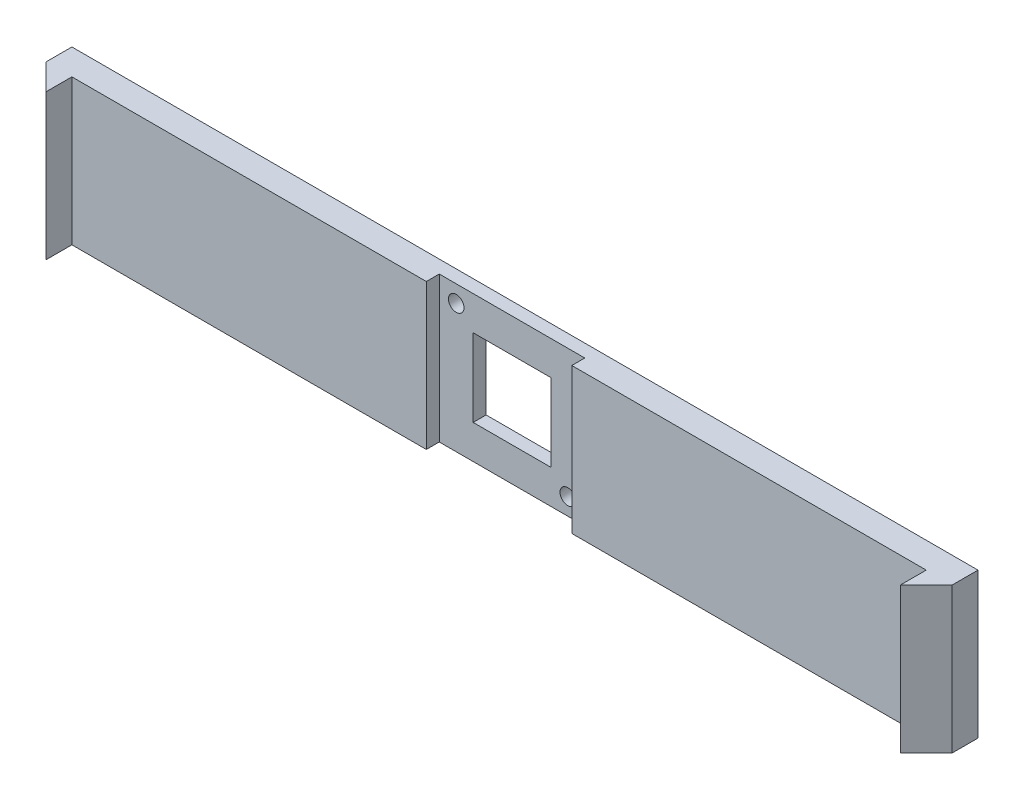
ISO-10303-21;
HEADER;
FILE_DESCRIPTION(('STEP AP214'),'2;1');
FILE_NAME('part.step','',(''),(''),'','','');
FILE_SCHEMA(('AUTOMOTIVE_DESIGN { 1 0 10303 214 1 1 1 1 }'));
ENDSEC;
DATA;
#1=APPLICATION_CONTEXT('core data for automotive mechanical design processes');
#2=APPLICATION_PROTOCOL_DEFINITION('international standard','automotive_design',2000,#1);
#3=PRODUCT_CONTEXT('',#1,'mechanical');
#4=PRODUCT('Part','Part','',(#3));
#5=PRODUCT_RELATED_PRODUCT_CATEGORY('part','',(#4));
#6=PRODUCT_DEFINITION_FORMATION('','',#4);
#7=PRODUCT_DEFINITION_CONTEXT('part definition',#1,'design');
#8=PRODUCT_DEFINITION('design','',#6,#7);
#9=PRODUCT_DEFINITION_SHAPE('','',#8);
#10=(LENGTH_UNIT() NAMED_UNIT(*) SI_UNIT(.MILLI.,.METRE.));
#11=(NAMED_UNIT(*) PLANE_ANGLE_UNIT() SI_UNIT($,.RADIAN.));
#12=(NAMED_UNIT(*) SI_UNIT($,.STERADIAN.) SOLID_ANGLE_UNIT());
#13=UNCERTAINTY_MEASURE_WITH_UNIT(LENGTH_MEASURE(1.E-05),#10,'distance_accuracy_value','');
#14=(GEOMETRIC_REPRESENTATION_CONTEXT(3) GLOBAL_UNCERTAINTY_ASSIGNED_CONTEXT((#13)) GLOBAL_UNIT_ASSIGNED_CONTEXT((#10,
#11,#12)) REPRESENTATION_CONTEXT('',''));
#15=CARTESIAN_POINT('',(0.,0.,0.));
#16=DIRECTION('',(0.,0.,1.));
#17=DIRECTION('',(1.,0.,0.));
#18=AXIS2_PLACEMENT_3D('',#15,#16,#17);
#19=CARTESIAN_POINT('',(0.,0.,10.));
#20=DIRECTION('',(0.,0.,-1.));
#21=DIRECTION('',(-1.,0.,0.));
#22=AXIS2_PLACEMENT_3D('',#19,#20,#21);
#23=PLANE('',#22);
#24=DIRECTION('',(0.,1.,0.));
#25=VECTOR('',#24,1.);
#26=CARTESIAN_POINT('',(-165.,-28.1,10.));
#27=LINE('',#26,#25);
#28=CARTESIAN_POINT('',(-165.,-28.1,10.));
#29=VERTEX_POINT('',#28);
#30=CARTESIAN_POINT('',(-165.,28.1,10.));
#31=VERTEX_POINT('',#30);
#32=EDGE_CURVE('E198',#29,#31,#27,.T.);
#33=ORIENTED_EDGE('',*,*,#32,.F.);
#34=DIRECTION('',(1.,0.,0.));
#35=VECTOR('',#34,1.);
#36=CARTESIAN_POINT('',(-165.,-28.1,10.));
#37=LINE('',#36,#35);
#38=CARTESIAN_POINT('',(-28.1,-28.1,10.));
#39=VERTEX_POINT('',#38);
#40=EDGE_CURVE('E11',#29,#39,#37,.T.);
#41=ORIENTED_EDGE('',*,*,#40,.T.);
#42=DIRECTION('',(0.,-1.,0.));
#43=VECTOR('',#42,1.);
#44=CARTESIAN_POINT('',(-28.1,-28.1,10.));
#45=LINE('',#44,#43);
#46=CARTESIAN_POINT('',(-28.1,28.1,10.));
#47=VERTEX_POINT('',#46);
#48=EDGE_CURVE('E244',#47,#39,#45,.T.);
#49=ORIENTED_EDGE('',*,*,#48,.F.);
#50=DIRECTION('',(-1.,0.,0.));
#51=VECTOR('',#50,1.);
#52=CARTESIAN_POINT('',(-165.,28.1,10.));
#53=LINE('',#52,#51);
#54=EDGE_CURVE('E269',#47,#31,#53,.T.);
#55=ORIENTED_EDGE('',*,*,#54,.T.);
#56=EDGE_LOOP('',(#33,#41,#49,#55));
#57=FACE_BOUND('',#56,.T.);
#58=ADVANCED_FACE('F36',(#57),#23,.F.);
#59=DIRECTION('',(0.,-1.,0.));
#60=VECTOR('',#59,1.);
#61=CARTESIAN_POINT('',(165.,28.1,10.));
#62=LINE('',#61,#60);
#63=CARTESIAN_POINT('',(165.,28.1,10.));
#64=VERTEX_POINT('',#63);
#65=CARTESIAN_POINT('',(165.,-28.1,10.));
#66=VERTEX_POINT('',#65);
#67=EDGE_CURVE('E222',#64,#66,#62,.T.);
#68=ORIENTED_EDGE('',*,*,#67,.F.);
#69=CARTESIAN_POINT('',(28.1,28.1,10.));
#70=VERTEX_POINT('',#69);
#71=EDGE_CURVE('E268',#64,#70,#53,.T.);
#72=ORIENTED_EDGE('',*,*,#71,.T.);
#73=DIRECTION('',(0.,1.,0.));
#74=VECTOR('',#73,1.);
#75=CARTESIAN_POINT('',(28.1,-28.1,10.));
#76=LINE('',#75,#74);
#77=CARTESIAN_POINT('',(28.1,-28.1,10.));
#78=VERTEX_POINT('',#77);
#79=EDGE_CURVE('E239',#78,#70,#76,.T.);
#80=ORIENTED_EDGE('',*,*,#79,.F.);
#81=EDGE_CURVE('E45',#78,#66,#37,.T.);
#82=ORIENTED_EDGE('',*,*,#81,.T.);
#83=EDGE_LOOP('',(#68,#72,#80,#82));
#84=FACE_BOUND('',#83,.T.);
#85=ADVANCED_FACE('F310',(#84),#23,.F.);
#86=CARTESIAN_POINT('',(-165.,28.1,10.));
#87=DIRECTION('',(0.,-1.,0.));
#88=DIRECTION('',(0.,0.,-1.));
#89=AXIS2_PLACEMENT_3D('',#86,#87,#88);
#90=PLANE('',#89);
#91=DIRECTION('',(0.,0.,-1.));
#92=VECTOR('',#91,1.);
#93=CARTESIAN_POINT('',(-175.,28.1,0.));
#94=LINE('',#93,#92);
#95=CARTESIAN_POINT('',(-175.,28.1,10.));
#96=VERTEX_POINT('',#95);
#97=CARTESIAN_POINT('',(-175.,28.1,0.));
#98=VERTEX_POINT('',#97);
#99=EDGE_CURVE('E213',#96,#98,#94,.T.);
#100=ORIENTED_EDGE('',*,*,#99,.F.);
#101=DIRECTION('',(-0.707106781186548,0.,-0.707106781186547));
#102=VECTOR('',#101,1.);
#103=CARTESIAN_POINT('',(-165.,28.1,20.));
#104=LINE('',#103,#102);
#105=CARTESIAN_POINT('',(-165.,28.1,20.));
#106=VERTEX_POINT('',#105);
#107=EDGE_CURVE('E187',#106,#96,#104,.T.);
#108=ORIENTED_EDGE('',*,*,#107,.F.);
#109=DIRECTION('',(0.,0.,-1.));
#110=VECTOR('',#109,1.);
#111=CARTESIAN_POINT('',(-165.,28.1,20.));
#112=LINE('',#111,#110);
#113=EDGE_CURVE('E201',#106,#31,#112,.T.);
#114=ORIENTED_EDGE('',*,*,#113,.T.);
#115=ORIENTED_EDGE('',*,*,#54,.F.);
#116=DIRECTION('',(0.,0.,1.));
#117=VECTOR('',#116,1.);
#118=CARTESIAN_POINT('',(-28.1,28.1,5.));
#119=LINE('',#118,#117);
#120=CARTESIAN_POINT('',(-28.1,28.1,5.));
#121=VERTEX_POINT('',#120);
#122=EDGE_CURVE('E264',#121,#47,#119,.T.);
#123=ORIENTED_EDGE('',*,*,#122,.F.);
#124=DIRECTION('',(-1.,0.,0.));
#125=VECTOR('',#124,1.);
#126=CARTESIAN_POINT('',(-28.1,28.1,5.));
#127=LINE('',#126,#125);
#128=CARTESIAN_POINT('',(28.1,28.1,5.));
#129=VERTEX_POINT('',#128);
#130=EDGE_CURVE('E243',#129,#121,#127,.T.);
#131=ORIENTED_EDGE('',*,*,#130,.F.);
#132=DIRECTION('',(0.,0.,1.));
#133=VECTOR('',#132,1.);
#134=CARTESIAN_POINT('',(28.1,28.1,5.));
#135=LINE('',#134,#133);
#136=EDGE_CURVE('E253',#129,#70,#135,.T.);
#137=ORIENTED_EDGE('',*,*,#136,.T.);
#138=ORIENTED_EDGE('',*,*,#71,.F.);
#139=DIRECTION('',(0.,0.,-1.));
#140=VECTOR('',#139,1.);
#141=CARTESIAN_POINT('',(165.,28.1,20.));
#142=LINE('',#141,#140);
#143=CARTESIAN_POINT('',(165.,28.1,20.));
#144=VERTEX_POINT('',#143);
#145=EDGE_CURVE('E229',#144,#64,#142,.T.);
#146=ORIENTED_EDGE('',*,*,#145,.F.);
#147=DIRECTION('',(-0.707106781186548,0.,0.707106781186547));
#148=VECTOR('',#147,1.);
#149=CARTESIAN_POINT('',(165.,28.1,20.));
#150=LINE('',#149,#148);
#151=CARTESIAN_POINT('',(175.,28.1,10.));
#152=VERTEX_POINT('',#151);
#153=EDGE_CURVE('E215',#152,#144,#150,.T.);
#154=ORIENTED_EDGE('',*,*,#153,.F.);
#155=DIRECTION('',(0.,0.,1.));
#156=VECTOR('',#155,1.);
#157=CARTESIAN_POINT('',(175.,28.1,10.));
#158=LINE('',#157,#156);
#159=CARTESIAN_POINT('',(175.,28.1,0.));
#160=VERTEX_POINT('',#159);
#161=EDGE_CURVE('E236',#160,#152,#158,.T.);
#162=ORIENTED_EDGE('',*,*,#161,.F.);
#163=DIRECTION('',(-1.,0.,0.));
#164=VECTOR('',#163,1.);
#165=CARTESIAN_POINT('',(-165.,28.1,0.));
#166=LINE('',#165,#164);
#167=EDGE_CURVE('E260',#160,#98,#166,.T.);
#168=ORIENTED_EDGE('',*,*,#167,.T.);
#169=EDGE_LOOP('',(#100,#108,#114,#115,#123,#131,#137,#138,#146,#154,#162,#168));
#170=FACE_BOUND('',#169,.T.);
#171=ADVANCED_FACE('F38',(#170),#90,.F.);
#172=CARTESIAN_POINT('',(-165.,-28.1,10.));
#173=DIRECTION('',(0.,1.,0.));
#174=DIRECTION('',(0.,0.,1.));
#175=AXIS2_PLACEMENT_3D('',#172,#173,#174);
#176=PLANE('',#175);
#177=DIRECTION('',(0.,0.,-1.));
#178=VECTOR('',#177,1.);
#179=CARTESIAN_POINT('',(-165.,-28.1,20.));
#180=LINE('',#179,#178);
#181=CARTESIAN_POINT('',(-165.,-28.1,20.));
#182=VERTEX_POINT('',#181);
#183=EDGE_CURVE('E205',#182,#29,#180,.T.);
#184=ORIENTED_EDGE('',*,*,#183,.F.);
#185=DIRECTION('',(-0.707106781186548,0.,-0.707106781186547));
#186=VECTOR('',#185,1.);
#187=CARTESIAN_POINT('',(-165.,-28.1,20.));
#188=LINE('',#187,#186);
#189=CARTESIAN_POINT('',(-175.,-28.1,10.));
#190=VERTEX_POINT('',#189);
#191=EDGE_CURVE('E191',#182,#190,#188,.T.);
#192=ORIENTED_EDGE('',*,*,#191,.T.);
#193=DIRECTION('',(0.,0.,1.));
#194=VECTOR('',#193,1.);
#195=CARTESIAN_POINT('',(-175.,-28.1,0.));
#196=LINE('',#195,#194);
#197=CARTESIAN_POINT('',(-175.,-28.1,0.));
#198=VERTEX_POINT('',#197);
#199=EDGE_CURVE('E210',#198,#190,#196,.T.);
#200=ORIENTED_EDGE('',*,*,#199,.F.);
#201=DIRECTION('',(1.,0.,0.));
#202=VECTOR('',#201,1.);
#203=CARTESIAN_POINT('',(-165.,-28.1,0.));
#204=LINE('',#203,#202);
#205=CARTESIAN_POINT('',(175.,-28.1,0.));
#206=VERTEX_POINT('',#205);
#207=EDGE_CURVE('E40',#198,#206,#204,.T.);
#208=ORIENTED_EDGE('',*,*,#207,.T.);
#209=DIRECTION('',(0.,0.,-1.));
#210=VECTOR('',#209,1.);
#211=CARTESIAN_POINT('',(175.,-28.1,10.));
#212=LINE('',#211,#210);
#213=CARTESIAN_POINT('',(175.,-28.1,10.));
#214=VERTEX_POINT('',#213);
#215=EDGE_CURVE('E231',#214,#206,#212,.T.);
#216=ORIENTED_EDGE('',*,*,#215,.F.);
#217=DIRECTION('',(-0.707106781186548,0.,0.707106781186547));
#218=VECTOR('',#217,1.);
#219=CARTESIAN_POINT('',(165.,-28.1,20.));
#220=LINE('',#219,#218);
#221=CARTESIAN_POINT('',(165.,-28.1,20.));
#222=VERTEX_POINT('',#221);
#223=EDGE_CURVE('E216',#214,#222,#220,.T.);
#224=ORIENTED_EDGE('',*,*,#223,.T.);
#225=DIRECTION('',(0.,0.,-1.));
#226=VECTOR('',#225,1.);
#227=CARTESIAN_POINT('',(165.,-28.1,20.));
#228=LINE('',#227,#226);
#229=EDGE_CURVE('E225',#222,#66,#228,.T.);
#230=ORIENTED_EDGE('',*,*,#229,.T.);
#231=ORIENTED_EDGE('',*,*,#81,.F.);
#232=DIRECTION('',(0.,0.,1.));
#233=VECTOR('',#232,1.);
#234=CARTESIAN_POINT('',(28.1,-28.1,5.));
#235=LINE('',#234,#233);
#236=CARTESIAN_POINT('',(28.1,-28.1,5.));
#237=VERTEX_POINT('',#236);
#238=EDGE_CURVE('E258',#237,#78,#235,.T.);
#239=ORIENTED_EDGE('',*,*,#238,.F.);
#240=DIRECTION('',(1.,0.,0.));
#241=VECTOR('',#240,1.);
#242=CARTESIAN_POINT('',(-28.1,-28.1,5.));
#243=LINE('',#242,#241);
#244=CARTESIAN_POINT('',(-28.1,-28.1,5.));
#245=VERTEX_POINT('',#244);
#246=EDGE_CURVE('E250',#245,#237,#243,.T.);
#247=ORIENTED_EDGE('',*,*,#246,.F.);
#248=DIRECTION('',(0.,0.,1.));
#249=VECTOR('',#248,1.);
#250=CARTESIAN_POINT('',(-28.1,-28.1,5.));
#251=LINE('',#250,#249);
#252=EDGE_CURVE('E261',#245,#39,#251,.T.);
#253=ORIENTED_EDGE('',*,*,#252,.T.);
#254=ORIENTED_EDGE('',*,*,#40,.F.);
#255=EDGE_LOOP('',(#184,#192,#200,#208,#216,#224,#230,#231,#239,#247,#253,#254));
#256=FACE_BOUND('',#255,.T.);
#257=ADVANCED_FACE('F294',(#256),#176,.F.);
#258=CARTESIAN_POINT('',(0.,0.,0.));
#259=DIRECTION('',(0.,0.,-1.));
#260=DIRECTION('',(-1.,0.,0.));
#261=AXIS2_PLACEMENT_3D('',#258,#259,#260);
#262=PLANE('',#261);
#263=CARTESIAN_POINT('',(-21.55,21.55,0.));
#264=DIRECTION('',(0.,0.,1.));
#265=DIRECTION('',(1.,0.,0.));
#266=AXIS2_PLACEMENT_3D('',#263,#264,#265);
#267=CIRCLE('',#266,3.);
#268=CARTESIAN_POINT('',(-18.55,21.55,0.));
#269=VERTEX_POINT('',#268);
#270=EDGE_CURVE('E181',#269,#269,#267,.T.);
#271=ORIENTED_EDGE('',*,*,#270,.T.);
#272=EDGE_LOOP('',(#271));
#273=FACE_BOUND('',#272,.T.);
#274=CARTESIAN_POINT('',(21.55,-21.55,0.));
#275=DIRECTION('',(0.,0.,1.));
#276=DIRECTION('',(1.,0.,0.));
#277=AXIS2_PLACEMENT_3D('',#274,#275,#276);
#278=CIRCLE('',#277,3.);
#279=CARTESIAN_POINT('',(24.55,-21.55,0.));
#280=VERTEX_POINT('',#279);
#281=EDGE_CURVE('E492',#280,#280,#278,.T.);
#282=ORIENTED_EDGE('',*,*,#281,.T.);
#283=EDGE_LOOP('',(#282));
#284=FACE_BOUND('',#283,.T.);
#285=DIRECTION('',(0.,1.,0.));
#286=VECTOR('',#285,1.);
#287=CARTESIAN_POINT('',(15.,-15.,0.));
#288=LINE('',#287,#286);
#289=CARTESIAN_POINT('',(15.,-15.,0.));
#290=VERTEX_POINT('',#289);
#291=CARTESIAN_POINT('',(15.,15.,0.));
#292=VERTEX_POINT('',#291);
#293=EDGE_CURVE('E152',#290,#292,#288,.T.);
#294=ORIENTED_EDGE('',*,*,#293,.T.);
#295=DIRECTION('',(-1.,0.,0.));
#296=VECTOR('',#295,1.);
#297=CARTESIAN_POINT('',(-15.,15.,0.));
#298=LINE('',#297,#296);
#299=CARTESIAN_POINT('',(-15.,15.,0.));
#300=VERTEX_POINT('',#299);
#301=EDGE_CURVE('E161',#292,#300,#298,.T.);
#302=ORIENTED_EDGE('',*,*,#301,.T.);
#303=DIRECTION('',(0.,-1.,0.));
#304=VECTOR('',#303,1.);
#305=CARTESIAN_POINT('',(-15.,-15.,0.));
#306=LINE('',#305,#304);
#307=CARTESIAN_POINT('',(-15.,-15.,0.));
#308=VERTEX_POINT('',#307);
#309=EDGE_CURVE('E53',#300,#308,#306,.T.);
#310=ORIENTED_EDGE('',*,*,#309,.T.);
#311=DIRECTION('',(1.,0.,0.));
#312=VECTOR('',#311,1.);
#313=CARTESIAN_POINT('',(-15.,-15.,0.));
#314=LINE('',#313,#312);
#315=EDGE_CURVE('E158',#308,#290,#314,.T.);
#316=ORIENTED_EDGE('',*,*,#315,.T.);
#317=EDGE_LOOP('',(#294,#302,#310,#316));
#318=FACE_BOUND('',#317,.T.);
#319=ORIENTED_EDGE('',*,*,#167,.F.);
#320=DIRECTION('',(0.,1.,0.));
#321=VECTOR('',#320,1.);
#322=CARTESIAN_POINT('',(175.,28.1,0.));
#323=LINE('',#322,#321);
#324=EDGE_CURVE('E233',#206,#160,#323,.T.);
#325=ORIENTED_EDGE('',*,*,#324,.F.);
#326=ORIENTED_EDGE('',*,*,#207,.F.);
#327=DIRECTION('',(0.,-1.,0.));
#328=VECTOR('',#327,1.);
#329=CARTESIAN_POINT('',(-175.,-28.1,0.));
#330=LINE('',#329,#328);
#331=EDGE_CURVE('E207',#98,#198,#330,.T.);
#332=ORIENTED_EDGE('',*,*,#331,.F.);
#333=EDGE_LOOP('',(#319,#325,#326,#332));
#334=FACE_BOUND('',#333,.T.);
#335=ADVANCED_FACE('F165',(#273,#284,#318,#334),#262,.T.);
#336=CARTESIAN_POINT('',(28.1,-28.1,5.));
#337=DIRECTION('',(1.,0.,0.));
#338=DIRECTION('',(0.,0.,-1.));
#339=AXIS2_PLACEMENT_3D('',#336,#337,#338);
#340=PLANE('',#339);
#341=ORIENTED_EDGE('',*,*,#79,.T.);
#342=ORIENTED_EDGE('',*,*,#136,.F.);
#343=DIRECTION('',(0.,1.,0.));
#344=VECTOR('',#343,1.);
#345=CARTESIAN_POINT('',(28.1,-28.1,5.));
#346=LINE('',#345,#344);
#347=EDGE_CURVE('E240',#237,#129,#346,.T.);
#348=ORIENTED_EDGE('',*,*,#347,.F.);
#349=ORIENTED_EDGE('',*,*,#238,.T.);
#350=EDGE_LOOP('',(#341,#342,#348,#349));
#351=FACE_BOUND('',#350,.T.);
#352=ADVANCED_FACE('F303',(#351),#340,.F.);
#353=CARTESIAN_POINT('',(-28.1,-28.1,5.));
#354=DIRECTION('',(-1.,0.,0.));
#355=DIRECTION('',(0.,0.,1.));
#356=AXIS2_PLACEMENT_3D('',#353,#354,#355);
#357=PLANE('',#356);
#358=ORIENTED_EDGE('',*,*,#48,.T.);
#359=ORIENTED_EDGE('',*,*,#252,.F.);
#360=DIRECTION('',(0.,-1.,0.));
#361=VECTOR('',#360,1.);
#362=CARTESIAN_POINT('',(-28.1,-28.1,5.));
#363=LINE('',#362,#361);
#364=EDGE_CURVE('E247',#121,#245,#363,.T.);
#365=ORIENTED_EDGE('',*,*,#364,.F.);
#366=ORIENTED_EDGE('',*,*,#122,.T.);
#367=EDGE_LOOP('',(#358,#359,#365,#366));
#368=FACE_BOUND('',#367,.T.);
#369=ADVANCED_FACE('F297',(#368),#357,.F.);
#370=CARTESIAN_POINT('',(0.,0.,5.));
#371=DIRECTION('',(0.,0.,-1.));
#372=DIRECTION('',(-1.,0.,0.));
#373=AXIS2_PLACEMENT_3D('',#370,#371,#372);
#374=PLANE('',#373);
#375=CARTESIAN_POINT('',(-21.55,21.55,5.));
#376=DIRECTION('',(0.,0.,1.));
#377=DIRECTION('',(1.,0.,0.));
#378=AXIS2_PLACEMENT_3D('',#375,#376,#377);
#379=CIRCLE('',#378,3.);
#380=CARTESIAN_POINT('',(-18.55,21.55,5.));
#381=VERTEX_POINT('',#380);
#382=EDGE_CURVE('E490',#381,#381,#379,.T.);
#383=ORIENTED_EDGE('',*,*,#382,.F.);
#384=EDGE_LOOP('',(#383));
#385=FACE_BOUND('',#384,.T.);
#386=CARTESIAN_POINT('',(21.55,-21.55,5.));
#387=DIRECTION('',(0.,0.,1.));
#388=DIRECTION('',(1.,0.,0.));
#389=AXIS2_PLACEMENT_3D('',#386,#387,#388);
#390=CIRCLE('',#389,3.);
#391=CARTESIAN_POINT('',(24.55,-21.55,5.));
#392=VERTEX_POINT('',#391);
#393=EDGE_CURVE('E174',#392,#392,#390,.T.);
#394=ORIENTED_EDGE('',*,*,#393,.F.);
#395=EDGE_LOOP('',(#394));
#396=FACE_BOUND('',#395,.T.);
#397=DIRECTION('',(-1.,0.,0.));
#398=VECTOR('',#397,1.);
#399=CARTESIAN_POINT('',(-15.,15.,5.));
#400=LINE('',#399,#398);
#401=CARTESIAN_POINT('',(15.,15.,5.));
#402=VERTEX_POINT('',#401);
#403=CARTESIAN_POINT('',(-15.,15.,5.));
#404=VERTEX_POINT('',#403);
#405=EDGE_CURVE('E180',#402,#404,#400,.T.);
#406=ORIENTED_EDGE('',*,*,#405,.F.);
#407=DIRECTION('',(0.,1.,0.));
#408=VECTOR('',#407,1.);
#409=CARTESIAN_POINT('',(15.,-15.,5.));
#410=LINE('',#409,#408);
#411=CARTESIAN_POINT('',(15.,-15.,5.));
#412=VERTEX_POINT('',#411);
#413=EDGE_CURVE('E61',#412,#402,#410,.T.);
#414=ORIENTED_EDGE('',*,*,#413,.F.);
#415=DIRECTION('',(1.,0.,0.));
#416=VECTOR('',#415,1.);
#417=CARTESIAN_POINT('',(-15.,-15.,5.));
#418=LINE('',#417,#416);
#419=CARTESIAN_POINT('',(-15.,-15.,5.));
#420=VERTEX_POINT('',#419);
#421=EDGE_CURVE('E168',#420,#412,#418,.T.);
#422=ORIENTED_EDGE('',*,*,#421,.F.);
#423=DIRECTION('',(0.,-1.,0.));
#424=VECTOR('',#423,1.);
#425=CARTESIAN_POINT('',(-15.,-15.,5.));
#426=LINE('',#425,#424);
#427=EDGE_CURVE('E171',#404,#420,#426,.T.);
#428=ORIENTED_EDGE('',*,*,#427,.F.);
#429=EDGE_LOOP('',(#406,#414,#422,#428));
#430=FACE_BOUND('',#429,.T.);
#431=ORIENTED_EDGE('',*,*,#347,.T.);
#432=ORIENTED_EDGE('',*,*,#130,.T.);
#433=ORIENTED_EDGE('',*,*,#364,.T.);
#434=ORIENTED_EDGE('',*,*,#246,.T.);
#435=EDGE_LOOP('',(#431,#432,#433,#434));
#436=FACE_BOUND('',#435,.T.);
#437=ADVANCED_FACE('F299',(#385,#396,#430,#436),#374,.F.);
#438=CARTESIAN_POINT('',(175.,0.,0.));
#439=DIRECTION('',(1.,0.,0.));
#440=DIRECTION('',(0.,0.,-1.));
#441=AXIS2_PLACEMENT_3D('',#438,#439,#440);
#442=PLANE('',#441);
#443=DIRECTION('',(0.,1.,0.));
#444=VECTOR('',#443,1.);
#445=CARTESIAN_POINT('',(175.,-28.1,10.));
#446=LINE('',#445,#444);
#447=EDGE_CURVE('E219',#214,#152,#446,.T.);
#448=ORIENTED_EDGE('',*,*,#447,.F.);
#449=ORIENTED_EDGE('',*,*,#215,.T.);
#450=ORIENTED_EDGE('',*,*,#324,.T.);
#451=ORIENTED_EDGE('',*,*,#161,.T.);
#452=EDGE_LOOP('',(#448,#449,#450,#451));
#453=FACE_BOUND('',#452,.T.);
#454=ADVANCED_FACE('F319',(#453),#442,.T.);
#455=CARTESIAN_POINT('',(165.,28.1,20.));
#456=DIRECTION('',(1.,0.,0.));
#457=DIRECTION('',(0.,0.,-1.));
#458=AXIS2_PLACEMENT_3D('',#455,#456,#457);
#459=PLANE('',#458);
#460=ORIENTED_EDGE('',*,*,#67,.T.);
#461=ORIENTED_EDGE('',*,*,#229,.F.);
#462=DIRECTION('',(0.,-1.,0.));
#463=VECTOR('',#462,1.);
#464=CARTESIAN_POINT('',(165.,28.1,20.));
#465=LINE('',#464,#463);
#466=EDGE_CURVE('E223',#144,#222,#465,.T.);
#467=ORIENTED_EDGE('',*,*,#466,.F.);
#468=ORIENTED_EDGE('',*,*,#145,.T.);
#469=EDGE_LOOP('',(#460,#461,#467,#468));
#470=FACE_BOUND('',#469,.T.);
#471=ADVANCED_FACE('F314',(#470),#459,.F.);
#472=CARTESIAN_POINT('',(165.,-28.1,20.));
#473=DIRECTION('',(-0.707106781186547,0.,-0.707106781186548));
#474=DIRECTION('',(-0.707106781186548,0.,0.707106781186547));
#475=AXIS2_PLACEMENT_3D('',#472,#473,#474);
#476=PLANE('',#475);
#477=ORIENTED_EDGE('',*,*,#153,.T.);
#478=ORIENTED_EDGE('',*,*,#466,.T.);
#479=ORIENTED_EDGE('',*,*,#223,.F.);
#480=ORIENTED_EDGE('',*,*,#447,.T.);
#481=EDGE_LOOP('',(#477,#478,#479,#480));
#482=FACE_BOUND('',#481,.T.);
#483=ADVANCED_FACE('F380',(#482),#476,.F.);
#484=CARTESIAN_POINT('',(-175.,0.,0.));
#485=DIRECTION('',(1.,0.,0.));
#486=DIRECTION('',(0.,0.,-1.));
#487=AXIS2_PLACEMENT_3D('',#484,#485,#486);
#488=PLANE('',#487);
#489=ORIENTED_EDGE('',*,*,#199,.T.);
#490=DIRECTION('',(0.,1.,0.));
#491=VECTOR('',#490,1.);
#492=CARTESIAN_POINT('',(-175.,-28.1,10.));
#493=LINE('',#492,#491);
#494=EDGE_CURVE('E194',#190,#96,#493,.T.);
#495=ORIENTED_EDGE('',*,*,#494,.T.);
#496=ORIENTED_EDGE('',*,*,#99,.T.);
#497=ORIENTED_EDGE('',*,*,#331,.T.);
#498=EDGE_LOOP('',(#489,#495,#496,#497));
#499=FACE_BOUND('',#498,.T.);
#500=ADVANCED_FACE('F321',(#499),#488,.F.);
#501=CARTESIAN_POINT('',(-165.,-28.1,20.));
#502=DIRECTION('',(-1.,0.,0.));
#503=DIRECTION('',(0.,0.,1.));
#504=AXIS2_PLACEMENT_3D('',#501,#502,#503);
#505=PLANE('',#504);
#506=ORIENTED_EDGE('',*,*,#32,.T.);
#507=ORIENTED_EDGE('',*,*,#113,.F.);
#508=DIRECTION('',(0.,1.,0.));
#509=VECTOR('',#508,1.);
#510=CARTESIAN_POINT('',(-165.,-28.1,20.));
#511=LINE('',#510,#509);
#512=EDGE_CURVE('E199',#182,#106,#511,.T.);
#513=ORIENTED_EDGE('',*,*,#512,.F.);
#514=ORIENTED_EDGE('',*,*,#183,.T.);
#515=EDGE_LOOP('',(#506,#507,#513,#514));
#516=FACE_BOUND('',#515,.T.);
#517=ADVANCED_FACE('F292',(#516),#505,.F.);
#518=CARTESIAN_POINT('',(-165.,-28.1,20.));
#519=DIRECTION('',(0.707106781186547,0.,-0.707106781186548));
#520=DIRECTION('',(-0.707106781186548,0.,-0.707106781186547));
#521=AXIS2_PLACEMENT_3D('',#518,#519,#520);
#522=PLANE('',#521);
#523=ORIENTED_EDGE('',*,*,#107,.T.);
#524=ORIENTED_EDGE('',*,*,#494,.F.);
#525=ORIENTED_EDGE('',*,*,#191,.F.);
#526=ORIENTED_EDGE('',*,*,#512,.T.);
#527=EDGE_LOOP('',(#523,#524,#525,#526));
#528=FACE_BOUND('',#527,.T.);
#529=ADVANCED_FACE('F323',(#528),#522,.F.);
#530=CARTESIAN_POINT('',(15.,-15.,0.));
#531=DIRECTION('',(1.,0.,0.));
#532=DIRECTION('',(0.,0.,-1.));
#533=AXIS2_PLACEMENT_3D('',#530,#531,#532);
#534=PLANE('',#533);
#535=ORIENTED_EDGE('',*,*,#413,.T.);
#536=DIRECTION('',(0.,0.,1.));
#537=VECTOR('',#536,1.);
#538=CARTESIAN_POINT('',(15.,15.,0.));
#539=LINE('',#538,#537);
#540=EDGE_CURVE('E148',#292,#402,#539,.T.);
#541=ORIENTED_EDGE('',*,*,#540,.F.);
#542=ORIENTED_EDGE('',*,*,#293,.F.);
#543=DIRECTION('',(0.,0.,1.));
#544=VECTOR('',#543,1.);
#545=CARTESIAN_POINT('',(15.,-15.,0.));
#546=LINE('',#545,#544);
#547=EDGE_CURVE('E185',#290,#412,#546,.T.);
#548=ORIENTED_EDGE('',*,*,#547,.T.);
#549=EDGE_LOOP('',(#535,#541,#542,#548));
#550=FACE_BOUND('',#549,.T.);
#551=ADVANCED_FACE('F150',(#550),#534,.F.);
#552=CARTESIAN_POINT('',(-15.,-15.,0.));
#553=DIRECTION('',(0.,-1.,0.));
#554=DIRECTION('',(0.,0.,-1.));
#555=AXIS2_PLACEMENT_3D('',#552,#553,#554);
#556=PLANE('',#555);
#557=ORIENTED_EDGE('',*,*,#421,.T.);
#558=ORIENTED_EDGE('',*,*,#547,.F.);
#559=ORIENTED_EDGE('',*,*,#315,.F.);
#560=DIRECTION('',(0.,0.,1.));
#561=VECTOR('',#560,1.);
#562=CARTESIAN_POINT('',(-15.,-15.,0.));
#563=LINE('',#562,#561);
#564=EDGE_CURVE('E188',#308,#420,#563,.T.);
#565=ORIENTED_EDGE('',*,*,#564,.T.);
#566=EDGE_LOOP('',(#557,#558,#559,#565));
#567=FACE_BOUND('',#566,.T.);
#568=ADVANCED_FACE('F330',(#567),#556,.F.);
#569=CARTESIAN_POINT('',(-15.,-15.,0.));
#570=DIRECTION('',(-1.,0.,0.));
#571=DIRECTION('',(0.,0.,1.));
#572=AXIS2_PLACEMENT_3D('',#569,#570,#571);
#573=PLANE('',#572);
#574=ORIENTED_EDGE('',*,*,#427,.T.);
#575=ORIENTED_EDGE('',*,*,#564,.F.);
#576=ORIENTED_EDGE('',*,*,#309,.F.);
#577=DIRECTION('',(0.,0.,1.));
#578=VECTOR('',#577,1.);
#579=CARTESIAN_POINT('',(-15.,15.,0.));
#580=LINE('',#579,#578);
#581=EDGE_CURVE('E157',#300,#404,#580,.T.);
#582=ORIENTED_EDGE('',*,*,#581,.T.);
#583=EDGE_LOOP('',(#574,#575,#576,#582));
#584=FACE_BOUND('',#583,.T.);
#585=ADVANCED_FACE('F442',(#584),#573,.F.);
#586=CARTESIAN_POINT('',(-15.,15.,0.));
#587=DIRECTION('',(0.,1.,0.));
#588=DIRECTION('',(0.,0.,1.));
#589=AXIS2_PLACEMENT_3D('',#586,#587,#588);
#590=PLANE('',#589);
#591=ORIENTED_EDGE('',*,*,#405,.T.);
#592=ORIENTED_EDGE('',*,*,#581,.F.);
#593=ORIENTED_EDGE('',*,*,#301,.F.);
#594=ORIENTED_EDGE('',*,*,#540,.T.);
#595=EDGE_LOOP('',(#591,#592,#593,#594));
#596=FACE_BOUND('',#595,.T.);
#597=ADVANCED_FACE('F162',(#596),#590,.F.);
#598=CARTESIAN_POINT('',(21.55,-21.55,0.));
#599=DIRECTION('',(0.,0.,1.));
#600=DIRECTION('',(1.,0.,0.));
#601=AXIS2_PLACEMENT_3D('',#598,#599,#600);
#602=CYLINDRICAL_SURFACE('',#601,3.);
#603=ORIENTED_EDGE('',*,*,#281,.F.);
#604=EDGE_LOOP('',(#603));
#605=FACE_BOUND('',#604,.T.);
#606=ORIENTED_EDGE('',*,*,#393,.T.);
#607=EDGE_LOOP('',(#606));
#608=FACE_BOUND('',#607,.T.);
#609=ADVANCED_FACE('F458',(#605,#608),#602,.F.);
#610=CARTESIAN_POINT('',(-21.55,21.55,0.));
#611=DIRECTION('',(0.,0.,1.));
#612=DIRECTION('',(1.,0.,0.));
#613=AXIS2_PLACEMENT_3D('',#610,#611,#612);
#614=CYLINDRICAL_SURFACE('',#613,3.);
#615=ORIENTED_EDGE('',*,*,#270,.F.);
#616=EDGE_LOOP('',(#615));
#617=FACE_BOUND('',#616,.T.);
#618=ORIENTED_EDGE('',*,*,#382,.T.);
#619=EDGE_LOOP('',(#618));
#620=FACE_BOUND('',#619,.T.);
#621=ADVANCED_FACE('F467',(#617,#620),#614,.F.);
#622=CLOSED_SHELL('',(#58,#85,#171,#257,#335,#352,#369,#437,#454,#471,#483,#500,#517,#529,#551,
#568,#585,#597,#609,#621));
#623=MANIFOLD_SOLID_BREP('B2',#622);
#624=ADVANCED_BREP_SHAPE_REPRESENTATION('',(#18,#623),#14);
#625=SHAPE_DEFINITION_REPRESENTATION(#9,#624);
ENDSEC;
END-ISO-10303-21;
